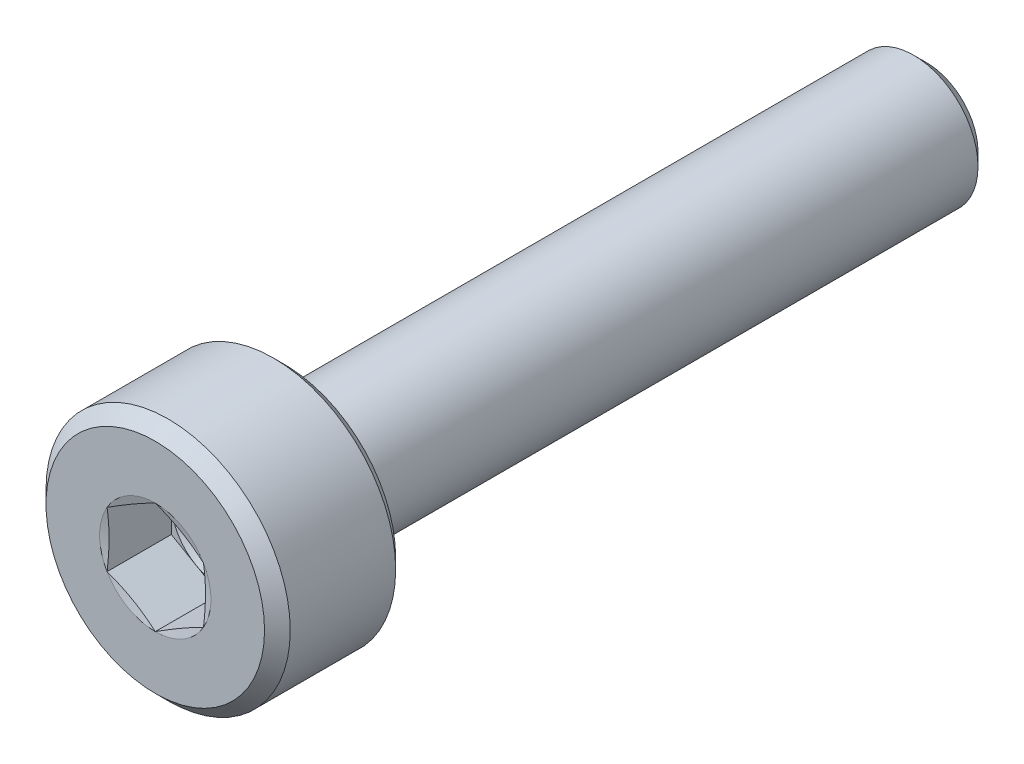
ISO-10303-21;
HEADER;
FILE_DESCRIPTION(('STEP AP214'),'2;1');
FILE_NAME('part.step','',(''),(''),'','','');
FILE_SCHEMA(('AUTOMOTIVE_DESIGN { 1 0 10303 214 1 1 1 1 }'));
ENDSEC;
DATA;
#1=APPLICATION_CONTEXT('core data for automotive mechanical design processes');
#2=APPLICATION_PROTOCOL_DEFINITION('international standard','automotive_design',2000,#1);
#3=PRODUCT_CONTEXT('',#1,'mechanical');
#4=PRODUCT('Part','Part','',(#3));
#5=PRODUCT_RELATED_PRODUCT_CATEGORY('part','',(#4));
#6=PRODUCT_DEFINITION_FORMATION('','',#4);
#7=PRODUCT_DEFINITION_CONTEXT('part definition',#1,'design');
#8=PRODUCT_DEFINITION('design','',#6,#7);
#9=PRODUCT_DEFINITION_SHAPE('','',#8);
#10=(LENGTH_UNIT() NAMED_UNIT(*) SI_UNIT(.MILLI.,.METRE.));
#11=(NAMED_UNIT(*) PLANE_ANGLE_UNIT() SI_UNIT($,.RADIAN.));
#12=(NAMED_UNIT(*) SI_UNIT($,.STERADIAN.) SOLID_ANGLE_UNIT());
#13=UNCERTAINTY_MEASURE_WITH_UNIT(LENGTH_MEASURE(1.E-05),#10,'distance_accuracy_value','');
#14=(GEOMETRIC_REPRESENTATION_CONTEXT(3) GLOBAL_UNCERTAINTY_ASSIGNED_CONTEXT((#13)) GLOBAL_UNIT_ASSIGNED_CONTEXT((#10,
#11,#12)) REPRESENTATION_CONTEXT('',''));
#15=CARTESIAN_POINT('',(0.,0.,0.));
#16=DIRECTION('',(0.,0.,1.));
#17=DIRECTION('',(1.,0.,0.));
#18=AXIS2_PLACEMENT_3D('',#15,#16,#17);
#19=CARTESIAN_POINT('',(0.,0.,0.));
#20=DIRECTION('',(0.,0.,-1.));
#21=DIRECTION('',(-1.,0.,0.));
#22=AXIS2_PLACEMENT_3D('',#19,#20,#21);
#23=PLANE('',#22);
#24=CARTESIAN_POINT('',(0.,0.,0.));
#25=DIRECTION('',(0.,0.,1.));
#26=DIRECTION('',(1.,0.,0.));
#27=AXIS2_PLACEMENT_3D('',#24,#25,#26);
#28=CIRCLE('',#27,1.7);
#29=CARTESIAN_POINT('',(1.7,0.,0.));
#30=VERTEX_POINT('',#29);
#31=EDGE_CURVE('E230',#30,#30,#28,.T.);
#32=ORIENTED_EDGE('',*,*,#31,.T.);
#33=EDGE_LOOP('',(#32));
#34=FACE_BOUND('',#33,.T.);
#35=CARTESIAN_POINT('',(0.,0.,0.));
#36=DIRECTION('',(0.,0.,1.));
#37=DIRECTION('',(1.,0.,0.));
#38=AXIS2_PLACEMENT_3D('',#35,#36,#37);
#39=CIRCLE('',#38,0.866025403784438);
#40=CARTESIAN_POINT('',(-0.75,-0.433012701892219,0.));
#41=VERTEX_POINT('',#40);
#42=CARTESIAN_POINT('',(0.,-0.866025403784438,0.));
#43=VERTEX_POINT('',#42);
#44=EDGE_CURVE('E156',#41,#43,#39,.T.);
#45=ORIENTED_EDGE('',*,*,#44,.F.);
#46=CARTESIAN_POINT('',(-0.75,0.433012701892219,0.));
#47=VERTEX_POINT('',#46);
#48=EDGE_CURVE('E155',#47,#41,#39,.T.);
#49=ORIENTED_EDGE('',*,*,#48,.F.);
#50=CARTESIAN_POINT('',(0.,0.866025403784438,0.));
#51=VERTEX_POINT('',#50);
#52=EDGE_CURVE('E122',#51,#47,#39,.T.);
#53=ORIENTED_EDGE('',*,*,#52,.F.);
#54=CARTESIAN_POINT('',(0.75,0.433012701892219,0.));
#55=VERTEX_POINT('',#54);
#56=EDGE_CURVE('E116',#55,#51,#39,.T.);
#57=ORIENTED_EDGE('',*,*,#56,.F.);
#58=CARTESIAN_POINT('',(0.749999999999999,-0.433012701892221,0.));
#59=VERTEX_POINT('',#58);
#60=EDGE_CURVE('E124',#59,#55,#39,.T.);
#61=ORIENTED_EDGE('',*,*,#60,.F.);
#62=EDGE_CURVE('E314',#43,#59,#39,.T.);
#63=ORIENTED_EDGE('',*,*,#62,.F.);
#64=EDGE_LOOP('',(#45,#49,#53,#57,#61,#63));
#65=FACE_BOUND('',#64,.T.);
#66=ADVANCED_FACE('F39',(#34,#65),#23,.F.);
#67=CARTESIAN_POINT('',(0.,0.,-0.2));
#68=DIRECTION('',(0.,0.,-1.));
#69=DIRECTION('',(-1.,0.,0.));
#70=AXIS2_PLACEMENT_3D('',#67,#68,#69);
#71=CONICAL_SURFACE('',#70,1.9,0.78539816339746);
#72=ORIENTED_EDGE('',*,*,#31,.F.);
#73=EDGE_LOOP('',(#72));
#74=FACE_BOUND('',#73,.T.);
#75=CARTESIAN_POINT('',(0.,0.,-0.2));
#76=DIRECTION('',(0.,0.,1.));
#77=DIRECTION('',(1.,0.,0.));
#78=AXIS2_PLACEMENT_3D('',#75,#76,#77);
#79=CIRCLE('',#78,1.9);
#80=CARTESIAN_POINT('',(1.9,0.,-0.2));
#81=VERTEX_POINT('',#80);
#82=EDGE_CURVE('E232',#81,#81,#79,.T.);
#83=ORIENTED_EDGE('',*,*,#82,.T.);
#84=EDGE_LOOP('',(#83));
#85=FACE_BOUND('',#84,.T.);
#86=ADVANCED_FACE('F221',(#74,#85),#71,.T.);
#87=CARTESIAN_POINT('',(0.,0.,0.));
#88=DIRECTION('',(0.,0.,1.));
#89=DIRECTION('',(1.,0.,0.));
#90=AXIS2_PLACEMENT_3D('',#87,#88,#89);
#91=CYLINDRICAL_SURFACE('',#90,1.9);
#92=ORIENTED_EDGE('',*,*,#82,.F.);
#93=EDGE_LOOP('',(#92));
#94=FACE_BOUND('',#93,.T.);
#95=CARTESIAN_POINT('',(0.,0.,-1.84));
#96=DIRECTION('',(0.,0.,1.));
#97=DIRECTION('',(1.,0.,0.));
#98=AXIS2_PLACEMENT_3D('',#95,#96,#97);
#99=CIRCLE('',#98,1.9);
#100=CARTESIAN_POINT('',(1.9,0.,-1.84));
#101=VERTEX_POINT('',#100);
#102=EDGE_CURVE('E235',#101,#101,#99,.T.);
#103=ORIENTED_EDGE('',*,*,#102,.T.);
#104=EDGE_LOOP('',(#103));
#105=FACE_BOUND('',#104,.T.);
#106=ADVANCED_FACE('F226',(#94,#105),#91,.T.);
#107=CARTESIAN_POINT('',(0.,0.,-2.));
#108=DIRECTION('',(0.,0.,1.));
#109=DIRECTION('',(1.,0.,0.));
#110=AXIS2_PLACEMENT_3D('',#107,#108,#109);
#111=CONICAL_SURFACE('',#110,1.74,0.785398163397452);
#112=ORIENTED_EDGE('',*,*,#102,.F.);
#113=EDGE_LOOP('',(#112));
#114=FACE_BOUND('',#113,.T.);
#115=CARTESIAN_POINT('',(0.,0.,-2.));
#116=DIRECTION('',(0.,0.,1.));
#117=DIRECTION('',(1.,0.,0.));
#118=AXIS2_PLACEMENT_3D('',#115,#116,#117);
#119=CIRCLE('',#118,1.74);
#120=CARTESIAN_POINT('',(1.74,0.,-2.));
#121=VERTEX_POINT('',#120);
#122=EDGE_CURVE('E240',#121,#121,#119,.T.);
#123=ORIENTED_EDGE('',*,*,#122,.T.);
#124=EDGE_LOOP('',(#123));
#125=FACE_BOUND('',#124,.T.);
#126=ADVANCED_FACE('F430',(#114,#125),#111,.T.);
#127=CARTESIAN_POINT('',(0.,1.74,-2.));
#128=DIRECTION('',(0.,0.,1.));
#129=DIRECTION('',(1.,0.,0.));
#130=AXIS2_PLACEMENT_3D('',#127,#128,#129);
#131=PLANE('',#130);
#132=ORIENTED_EDGE('',*,*,#122,.F.);
#133=EDGE_LOOP('',(#132));
#134=FACE_BOUND('',#133,.T.);
#135=CARTESIAN_POINT('',(0.,0.,-2.));
#136=DIRECTION('',(0.,0.,1.));
#137=DIRECTION('',(1.,0.,0.));
#138=AXIS2_PLACEMENT_3D('',#135,#136,#137);
#139=CIRCLE('',#138,1.3);
#140=CARTESIAN_POINT('',(1.3,0.,-2.));
#141=VERTEX_POINT('',#140);
#142=EDGE_CURVE('E243',#141,#141,#139,.T.);
#143=ORIENTED_EDGE('',*,*,#142,.T.);
#144=EDGE_LOOP('',(#143));
#145=FACE_BOUND('',#144,.T.);
#146=ADVANCED_FACE('F422',(#134,#145),#131,.F.);
#147=CARTESIAN_POINT('',(0.,0.,-2.1));
#148=DIRECTION('',(0.,0.,1.));
#149=DIRECTION('',(1.,0.,0.));
#150=AXIS2_PLACEMENT_3D('',#147,#148,#149);
#151=TOROIDAL_SURFACE('',#150,1.3,0.1);
#152=ORIENTED_EDGE('',*,*,#142,.F.);
#153=EDGE_LOOP('',(#152));
#154=FACE_BOUND('',#153,.T.);
#155=CARTESIAN_POINT('',(0.,0.,-2.05615763679786));
#156=DIRECTION('',(0.,0.,1.));
#157=DIRECTION('',(1.,0.,0.));
#158=AXIS2_PLACEMENT_3D('',#155,#156,#157);
#159=CIRCLE('',#158,1.21012315543561);
#160=CARTESIAN_POINT('',(1.21012315543561,0.,-2.05615763679786));
#161=VERTEX_POINT('',#160);
#162=EDGE_CURVE('E246',#161,#161,#159,.T.);
#163=ORIENTED_EDGE('',*,*,#162,.T.);
#164=EDGE_LOOP('',(#163));
#165=FACE_BOUND('',#164,.T.);
#166=ADVANCED_FACE('F414',(#154,#165),#151,.F.);
#167=CARTESIAN_POINT('',(0.,0.,-2.46615763679786));
#168=DIRECTION('',(0.,0.,1.));
#169=DIRECTION('',(1.,0.,0.));
#170=AXIS2_PLACEMENT_3D('',#167,#168,#169);
#171=CONICAL_SURFACE('',#170,1.01012315543561,0.453844001521509);
#172=ORIENTED_EDGE('',*,*,#162,.F.);
#173=EDGE_LOOP('',(#172));
#174=FACE_BOUND('',#173,.T.);
#175=CARTESIAN_POINT('',(0.,0.,-2.46615763679786));
#176=DIRECTION('',(0.,0.,1.));
#177=DIRECTION('',(1.,0.,0.));
#178=AXIS2_PLACEMENT_3D('',#175,#176,#177);
#179=CIRCLE('',#178,1.01012315543561);
#180=CARTESIAN_POINT('',(1.01012315543561,0.,-2.46615763679786));
#181=VERTEX_POINT('',#180);
#182=EDGE_CURVE('E249',#181,#181,#179,.T.);
#183=ORIENTED_EDGE('',*,*,#182,.T.);
#184=EDGE_LOOP('',(#183));
#185=FACE_BOUND('',#184,.T.);
#186=ADVANCED_FACE('F406',(#174,#185),#171,.T.);
#187=CARTESIAN_POINT('',(0.,0.,-2.51));
#188=DIRECTION('',(0.,0.,1.));
#189=DIRECTION('',(1.,0.,0.));
#190=AXIS2_PLACEMENT_3D('',#187,#188,#189);
#191=TOROIDAL_SURFACE('',#190,1.1,0.0999999999999999);
#192=ORIENTED_EDGE('',*,*,#182,.F.);
#193=EDGE_LOOP('',(#192));
#194=FACE_BOUND('',#193,.T.);
#195=CARTESIAN_POINT('',(0.,0.,-2.51));
#196=DIRECTION('',(0.,0.,1.));
#197=DIRECTION('',(1.,0.,0.));
#198=AXIS2_PLACEMENT_3D('',#195,#196,#197);
#199=CIRCLE('',#198,1.);
#200=CARTESIAN_POINT('',(1.,0.,-2.51));
#201=VERTEX_POINT('',#200);
#202=EDGE_CURVE('E252',#201,#201,#199,.T.);
#203=ORIENTED_EDGE('',*,*,#202,.T.);
#204=EDGE_LOOP('',(#203));
#205=FACE_BOUND('',#204,.T.);
#206=ADVANCED_FACE('F398',(#194,#205),#191,.F.);
#207=CARTESIAN_POINT('',(0.,0.,0.));
#208=DIRECTION('',(0.,0.,1.));
#209=DIRECTION('',(1.,0.,0.));
#210=AXIS2_PLACEMENT_3D('',#207,#208,#209);
#211=CYLINDRICAL_SURFACE('',#210,1.);
#212=ORIENTED_EDGE('',*,*,#202,.F.);
#213=EDGE_LOOP('',(#212));
#214=FACE_BOUND('',#213,.T.);
#215=CARTESIAN_POINT('',(0.,0.,-11.8));
#216=DIRECTION('',(0.,0.,1.));
#217=DIRECTION('',(1.,0.,0.));
#218=AXIS2_PLACEMENT_3D('',#215,#216,#217);
#219=CIRCLE('',#218,1.);
#220=CARTESIAN_POINT('',(1.,0.,-11.8));
#221=VERTEX_POINT('',#220);
#222=EDGE_CURVE('E255',#221,#221,#219,.T.);
#223=ORIENTED_EDGE('',*,*,#222,.T.);
#224=EDGE_LOOP('',(#223));
#225=FACE_BOUND('',#224,.T.);
#226=ADVANCED_FACE('F389',(#214,#225),#211,.T.);
#227=CARTESIAN_POINT('',(0.,0.,-12.));
#228=DIRECTION('',(0.,0.,1.));
#229=DIRECTION('',(1.,0.,0.));
#230=AXIS2_PLACEMENT_3D('',#227,#228,#229);
#231=CONICAL_SURFACE('',#230,0.8,0.785398163397434);
#232=ORIENTED_EDGE('',*,*,#222,.F.);
#233=EDGE_LOOP('',(#232));
#234=FACE_BOUND('',#233,.T.);
#235=CARTESIAN_POINT('',(0.,0.,-12.));
#236=DIRECTION('',(0.,0.,1.));
#237=DIRECTION('',(1.,0.,0.));
#238=AXIS2_PLACEMENT_3D('',#235,#236,#237);
#239=CIRCLE('',#238,0.8);
#240=CARTESIAN_POINT('',(0.8,0.,-12.));
#241=VERTEX_POINT('',#240);
#242=EDGE_CURVE('E258',#241,#241,#239,.T.);
#243=ORIENTED_EDGE('',*,*,#242,.T.);
#244=EDGE_LOOP('',(#243));
#245=FACE_BOUND('',#244,.T.);
#246=ADVANCED_FACE('F381',(#234,#245),#231,.T.);
#247=CARTESIAN_POINT('',(0.,0.8,-12.));
#248=DIRECTION('',(0.,0.,1.));
#249=DIRECTION('',(1.,0.,0.));
#250=AXIS2_PLACEMENT_3D('',#247,#248,#249);
#251=PLANE('',#250);
#252=ORIENTED_EDGE('',*,*,#242,.F.);
#253=EDGE_LOOP('',(#252));
#254=FACE_BOUND('',#253,.T.);
#255=ADVANCED_FACE('F375',(#254),#251,.F.);
#256=CARTESIAN_POINT('',(0.,0.,-0.0310889132455344));
#257=DIRECTION('',(0.,0.,1.));
#258=DIRECTION('',(1.,0.,0.));
#259=AXIS2_PLACEMENT_3D('',#256,#257,#258);
#260=CONICAL_SURFACE('',#259,0.75,1.30899693899575);
#261=ORIENTED_EDGE('',*,*,#52,.T.);
#262=CARTESIAN_POINT('',(-0.7502,0.432897231838381,3.09462948723988E-05));
#263=CARTESIAN_POINT('',(-0.719037840271989,0.450888713145879,-0.00479360311149042));
#264=CARTESIAN_POINT('',(-0.687819151238554,0.468912831663079,-0.00917362250903629));
#265=CARTESIAN_POINT('',(-0.625271438524168,0.505024770435926,-0.0168690566741957));
#266=CARTESIAN_POINT('',(-0.593942375178671,0.523112613591908,-0.0201840383063053));
#267=CARTESIAN_POINT('',(-0.53136401188606,0.559242248484343,-0.0255557361470388));
#268=CARTESIAN_POINT('',(-0.5001151357921,0.577283795509063,-0.0276188631563584));
#269=CARTESIAN_POINT('',(-0.437577500528089,0.613389916063223,-0.0303853199406949));
#270=CARTESIAN_POINT('',(-0.406288750264044,0.631454484450776,-0.0310889132455344));
#271=CARTESIAN_POINT('',(-0.343711249735956,0.667583621225882,-0.0310889132455345));
#272=CARTESIAN_POINT('',(-0.312422499471911,0.685648189613435,-0.0303853199406949));
#273=CARTESIAN_POINT('',(-0.2498848642079,0.721754310167594,-0.0276188631563584));
#274=CARTESIAN_POINT('',(-0.21863598811394,0.739795857192315,-0.0255557361470388));
#275=CARTESIAN_POINT('',(-0.156057624821329,0.77592549208475,-0.0201840383063053));
#276=CARTESIAN_POINT('',(-0.124728561475832,0.794013335240732,-0.0168690566741957));
#277=CARTESIAN_POINT('',(-0.0621808487614457,0.830125274013578,-0.00917362250903634));
#278=CARTESIAN_POINT('',(-0.0309621597280112,0.848149392530779,-0.00479360311149048));
#279=CARTESIAN_POINT('',(0.000200000000000003,0.866140873838276,3.09462948723373E-05));
#280=B_SPLINE_CURVE_WITH_KNOTS('',3,(#262,#263,#264,#265,#266,#267,#268,#269,#270,#271,#272,
#273,#274,#275,#276,#277,#278,#279),.UNSPECIFIED.,.F.,.F.,(4,2,2,2,2,2,2,2,4),(0.,
0.108920587259311,0.217885415043552,0.326287413293608,0.434668396966266,0.543049380638924,
0.651451378888981,0.760416206673221,0.869336793932533),.UNSPECIFIED.);
#281=EDGE_CURVE('E11',#47,#51,#280,.T.);
#282=ORIENTED_EDGE('',*,*,#281,.T.);
#283=EDGE_LOOP('',(#261,#282));
#284=FACE_BOUND('',#283,.T.);
#285=ADVANCED_FACE('F128',(#284),#260,.F.);
#286=CARTESIAN_POINT('',(-0.75,-1.14482258623613,0.13466962524668));
#287=CARTESIAN_POINT('',(-0.75,-1.07678185164575,0.11946091693451));
#288=CARTESIAN_POINT('',(-0.75,-1.00866186993933,0.104564139677019));
#289=CARTESIAN_POINT('',(-0.75,-0.872108780270127,0.0759343556155123));
#290=CARTESIAN_POINT('',(-0.75,-0.803675428468904,0.0622025196192108));
#291=CARTESIAN_POINT('',(-0.75,-0.667024328389678,0.0365778066728533));
#292=CARTESIAN_POINT('',(-0.75,-0.598809231475784,0.0246711034130511));
#293=CARTESIAN_POINT('',(-0.75,-0.461968565078349,0.00349957725576435));
#294=CARTESIAN_POINT('',(-0.75,-0.393343069174551,-0.00576570552870658));
#295=CARTESIAN_POINT('',(-0.75,-0.254874387193197,-0.0204880637590047));
#296=CARTESIAN_POINT('',(-0.75,-0.185026204144043,-0.0259009217168571));
#297=CARTESIAN_POINT('',(-0.75,-0.0451386456006473,-0.0315728233282039));
#298=CARTESIAN_POINT('',(-0.75,0.0249006157145767,-0.0318344646143007));
#299=CARTESIAN_POINT('',(-0.75,0.165046593870639,-0.0271336726580643));
#300=CARTESIAN_POINT('',(-0.75,0.235152611190908,-0.0221520199445757));
#301=CARTESIAN_POINT('',(-0.75,0.374971381665316,-0.00804964390688157));
#302=CARTESIAN_POINT('',(-0.75,0.444683810838038,0.00107409444110482));
#303=CARTESIAN_POINT('',(-0.75,0.57900664470664,0.0214252947723859));
#304=CARTESIAN_POINT('',(-0.75,0.643645711070564,0.0324706666633663));
#305=CARTESIAN_POINT('',(-0.75,0.772626203639037,0.0561976243366958));
#306=CARTESIAN_POINT('',(-0.75,0.836967591207445,0.0688794166647536));
#307=CARTESIAN_POINT('',(-0.75,0.96543538187879,0.0953387697110077));
#308=CARTESIAN_POINT('',(-0.75,1.02956173962238,0.109116548118427));
#309=CARTESIAN_POINT('',(-0.75,1.15764916486959,0.137422879220211));
#310=CARTESIAN_POINT('',(-0.75,1.22161022807931,0.151951451216337));
#311=CARTESIAN_POINT('',(-0.75,1.41205284321497,0.196019971996214));
#312=CARTESIAN_POINT('',(-0.75,1.53835925197156,0.226314183405895));
#313=CARTESIAN_POINT('',(-0.75,1.72754301618681,0.272539035787117));
#314=CARTESIAN_POINT('',(-0.75,1.79052001268668,0.28806821024875));
#315=CARTESIAN_POINT('',(-0.75,1.91641912521064,0.319338785610066));
#316=CARTESIAN_POINT('',(-0.75,1.97934124297332,0.335080179505711));
#317=CARTESIAN_POINT('',(-0.75,2.04224365999308,0.350900921516616));
#318=B_SPLINE_CURVE_WITH_KNOTS('',3,(#286,#287,#288,#289,#290,#291,#292,#293,#294,#295,#296,
#297,#298,#299,#300,#301,#302,#303,#304,#305,#306,#307,#308,#309,#310,#311,#312,#313,#314,#315,
#316,#317),.UNSPECIFIED.,.F.,.F.,(4,2,2,2,2,2,2,2,2,2,2,2,2,2,2,4),(0.,0.209172832960231,
0.418553461255022,0.626259888239563,0.833930130186138,1.04394713172849,1.25385822411851,
1.46454144122955,1.67537826112991,1.87207734374703,2.06880127765738,2.26556438371338,
2.46233255076827,2.85198678875997,3.04657695287832,3.24116071043612),.UNSPECIFIED.);
#319=EDGE_CURVE('E121',#41,#47,#318,.T.);
#320=ORIENTED_EDGE('',*,*,#319,.T.);
#321=ORIENTED_EDGE('',*,*,#48,.T.);
#322=EDGE_LOOP('',(#320,#321));
#323=FACE_BOUND('',#322,.T.);
#324=ADVANCED_FACE('F362',(#323),#260,.F.);
#325=CARTESIAN_POINT('',(0.000199999999999821,-0.866140873838277,3.0946294872561E-05));
#326=CARTESIAN_POINT('',(-0.0309621597280112,-0.84814939253078,-0.00479360311149026));
#327=CARTESIAN_POINT('',(-0.0621808487614458,-0.830125274013579,-0.00917362250903614));
#328=CARTESIAN_POINT('',(-0.124728561475833,-0.794013335240732,-0.0168690566741955));
#329=CARTESIAN_POINT('',(-0.15605762482133,-0.775925492084751,-0.0201840383063051));
#330=CARTESIAN_POINT('',(-0.218635988113941,-0.739795857192316,-0.0255557361470386));
#331=CARTESIAN_POINT('',(-0.2498848642079,-0.721754310167595,-0.0276188631563583));
#332=CARTESIAN_POINT('',(-0.312422499471911,-0.685648189613436,-0.0303853199406947));
#333=CARTESIAN_POINT('',(-0.343711249735956,-0.667583621225883,-0.0310889132455343));
#334=CARTESIAN_POINT('',(-0.406288750264045,-0.631454484450776,-0.0310889132455343));
#335=CARTESIAN_POINT('',(-0.437577500528089,-0.613389916063223,-0.0303853199406947));
#336=CARTESIAN_POINT('',(-0.5001151357921,-0.577283795509064,-0.0276188631563583));
#337=CARTESIAN_POINT('',(-0.53136401188606,-0.559242248484343,-0.0255557361470387));
#338=CARTESIAN_POINT('',(-0.593942375178671,-0.523112613591908,-0.0201840383063052));
#339=CARTESIAN_POINT('',(-0.625271438524168,-0.505024770435926,-0.0168690566741956));
#340=CARTESIAN_POINT('',(-0.687819151238555,-0.46891283166308,-0.0091736225090362));
#341=CARTESIAN_POINT('',(-0.719037840271989,-0.450888713145879,-0.00479360311149033));
#342=CARTESIAN_POINT('',(-0.7502,-0.432897231838382,3.09462948724902E-05));
#343=B_SPLINE_CURVE_WITH_KNOTS('',3,(#325,#326,#327,#328,#329,#330,#331,#332,#333,#334,#335,
#336,#337,#338,#339,#340,#341,#342),.UNSPECIFIED.,.F.,.F.,(4,2,2,2,2,2,2,2,4),(0.,
0.108920587259312,0.217885415043552,0.326287413293608,0.434668396966266,0.543049380638925,
0.651451378888981,0.760416206673221,0.869336793932533),.UNSPECIFIED.);
#344=EDGE_CURVE('E164',#43,#41,#343,.T.);
#345=ORIENTED_EDGE('',*,*,#344,.T.);
#346=ORIENTED_EDGE('',*,*,#44,.T.);
#347=EDGE_LOOP('',(#345,#346));
#348=FACE_BOUND('',#347,.T.);
#349=ADVANCED_FACE('F356',(#348),#260,.F.);
#350=CARTESIAN_POINT('',(0.7502,-0.432897231838382,3.0946294872516E-05));
#351=CARTESIAN_POINT('',(0.719037840271989,-0.45088871314588,-0.00479360311149026));
#352=CARTESIAN_POINT('',(0.687819151238554,-0.46891283166308,-0.00917362250903614));
#353=CARTESIAN_POINT('',(0.625271438524167,-0.505024770435927,-0.0168690566741955));
#354=CARTESIAN_POINT('',(0.59394237517867,-0.523112613591908,-0.0201840383063052));
#355=CARTESIAN_POINT('',(0.531364011886059,-0.559242248484343,-0.0255557361470386));
#356=CARTESIAN_POINT('',(0.5001151357921,-0.577283795509064,-0.0276188631563582));
#357=CARTESIAN_POINT('',(0.437577500528089,-0.613389916063224,-0.0303853199406947));
#358=CARTESIAN_POINT('',(0.406288750264044,-0.631454484450777,-0.0310889132455343));
#359=CARTESIAN_POINT('',(0.343711249735955,-0.667583621225883,-0.0310889132455343));
#360=CARTESIAN_POINT('',(0.312422499471911,-0.685648189613436,-0.0303853199406947));
#361=CARTESIAN_POINT('',(0.2498848642079,-0.721754310167595,-0.0276188631563582));
#362=CARTESIAN_POINT('',(0.21863598811394,-0.739795857192316,-0.0255557361470386));
#363=CARTESIAN_POINT('',(0.156057624821329,-0.775925492084751,-0.0201840383063051));
#364=CARTESIAN_POINT('',(0.124728561475832,-0.794013335240733,-0.0168690566741955));
#365=CARTESIAN_POINT('',(0.0621808487614455,-0.830125274013579,-0.00917362250903611));
#366=CARTESIAN_POINT('',(0.0309621597280109,-0.84814939253078,-0.00479360311149025));
#367=CARTESIAN_POINT('',(-0.000200000000000211,-0.866140873838277,3.09462948725669E-05));
#368=B_SPLINE_CURVE_WITH_KNOTS('',3,(#350,#351,#352,#353,#354,#355,#356,#357,#358,#359,#360,
#361,#362,#363,#364,#365,#366,#367),.UNSPECIFIED.,.F.,.F.,(4,2,2,2,2,2,2,2,4),(0.,
0.108920587259312,0.217885415043551,0.326287413293608,0.434668396966266,0.543049380638924,
0.651451378888981,0.760416206673221,0.869336793932533),.UNSPECIFIED.);
#369=EDGE_CURVE('E184',#59,#43,#368,.T.);
#370=ORIENTED_EDGE('',*,*,#369,.T.);
#371=ORIENTED_EDGE('',*,*,#62,.T.);
#372=EDGE_LOOP('',(#370,#371));
#373=FACE_BOUND('',#372,.T.);
#374=ADVANCED_FACE('F350',(#373),#260,.F.);
#375=CARTESIAN_POINT('',(0.75,-1.14482258623613,0.13466962524668));
#376=CARTESIAN_POINT('',(0.75,-1.07678185164575,0.11946091693451));
#377=CARTESIAN_POINT('',(0.75,-1.00866186993933,0.104564139677019));
#378=CARTESIAN_POINT('',(0.75,-0.872108780270127,0.0759343556155123));
#379=CARTESIAN_POINT('',(0.75,-0.803675428468904,0.0622025196192108));
#380=CARTESIAN_POINT('',(0.75,-0.667024328389678,0.0365778066728533));
#381=CARTESIAN_POINT('',(0.75,-0.598809231475784,0.0246711034130512));
#382=CARTESIAN_POINT('',(0.75,-0.461968565078349,0.00349957725576444));
#383=CARTESIAN_POINT('',(0.75,-0.393343069174551,-0.00576570552870653));
#384=CARTESIAN_POINT('',(0.75,-0.254874387193197,-0.0204880637590047));
#385=CARTESIAN_POINT('',(0.75,-0.185026204144043,-0.025900921716857));
#386=CARTESIAN_POINT('',(0.75,-0.045138645600648,-0.0315728233282039));
#387=CARTESIAN_POINT('',(0.75,0.0249006157145759,-0.0318344646143007));
#388=CARTESIAN_POINT('',(0.75,0.165046593870639,-0.0271336726580643));
#389=CARTESIAN_POINT('',(0.75,0.235152611190908,-0.0221520199445758));
#390=CARTESIAN_POINT('',(0.75,0.374971381665316,-0.00804964390688162));
#391=CARTESIAN_POINT('',(0.75,0.444683810838037,0.00107409444110477));
#392=CARTESIAN_POINT('',(0.75,0.57900664470664,0.0214252947723859));
#393=CARTESIAN_POINT('',(0.75,0.643645711070564,0.0324706666633663));
#394=CARTESIAN_POINT('',(0.75,0.772626203639037,0.0561976243366958));
#395=CARTESIAN_POINT('',(0.75,0.836967591207445,0.0688794166647536));
#396=CARTESIAN_POINT('',(0.75,0.965435381878789,0.0953387697110076));
#397=CARTESIAN_POINT('',(0.75,1.02956173962238,0.109116548118427));
#398=CARTESIAN_POINT('',(0.75,1.15764916486959,0.137422879220212));
#399=CARTESIAN_POINT('',(0.75,1.22161022807931,0.151951451216337));
#400=CARTESIAN_POINT('',(0.75,1.41205284321498,0.196019971996214));
#401=CARTESIAN_POINT('',(0.75,1.53835925197156,0.226314183405895));
#402=CARTESIAN_POINT('',(0.75,1.72754301618681,0.272539035787117));
#403=CARTESIAN_POINT('',(0.75,1.79052001268668,0.28806821024875));
#404=CARTESIAN_POINT('',(0.75,1.91641912521064,0.319338785610067));
#405=CARTESIAN_POINT('',(0.75,1.97934124297332,0.335080179505711));
#406=CARTESIAN_POINT('',(0.75,2.04224365999308,0.350900921516616));
#407=B_SPLINE_CURVE_WITH_KNOTS('',3,(#375,#376,#377,#378,#379,#380,#381,#382,#383,#384,#385,
#386,#387,#388,#389,#390,#391,#392,#393,#394,#395,#396,#397,#398,#399,#400,#401,#402,#403,#404,
#405,#406),.UNSPECIFIED.,.F.,.F.,(4,2,2,2,2,2,2,2,2,2,2,2,2,2,2,4),(0.,0.209172832960231,
0.418553461255022,0.626259888239563,0.833930130186138,1.04394713172849,1.25385822411851,
1.46454144122955,1.67537826112991,1.87207734374703,2.06880127765738,2.26556438371338,
2.46233255076827,2.85198678875997,3.04657695287832,3.24116071043612),.UNSPECIFIED.);
#408=EDGE_CURVE('E64',#55,#59,#407,.F.);
#409=ORIENTED_EDGE('',*,*,#408,.T.);
#410=ORIENTED_EDGE('',*,*,#60,.T.);
#411=EDGE_LOOP('',(#409,#410));
#412=FACE_BOUND('',#411,.T.);
#413=ADVANCED_FACE('F177',(#412),#260,.F.);
#414=CARTESIAN_POINT('',(-0.000199999999999916,0.866140873838276,3.094629487239E-05));
#415=CARTESIAN_POINT('',(0.0309621597280112,0.848149392530779,-0.00479360311149047));
#416=CARTESIAN_POINT('',(0.0621808487614458,0.830125274013578,-0.00917362250903634));
#417=CARTESIAN_POINT('',(0.124728561475833,0.794013335240732,-0.0168690566741957));
#418=CARTESIAN_POINT('',(0.15605762482133,0.77592549208475,-0.0201840383063053));
#419=CARTESIAN_POINT('',(0.218635988113941,0.739795857192315,-0.0255557361470388));
#420=CARTESIAN_POINT('',(0.2498848642079,0.721754310167594,-0.0276188631563584));
#421=CARTESIAN_POINT('',(0.312422499471911,0.685648189613435,-0.0303853199406949));
#422=CARTESIAN_POINT('',(0.343711249735956,0.667583621225882,-0.0310889132455344));
#423=CARTESIAN_POINT('',(0.406288750264045,0.631454484450776,-0.0310889132455344));
#424=CARTESIAN_POINT('',(0.437577500528089,0.613389916063223,-0.0303853199406949));
#425=CARTESIAN_POINT('',(0.5001151357921,0.577283795509063,-0.0276188631563584));
#426=CARTESIAN_POINT('',(0.53136401188606,0.559242248484342,-0.0255557361470388));
#427=CARTESIAN_POINT('',(0.593942375178671,0.523112613591907,-0.0201840383063053));
#428=CARTESIAN_POINT('',(0.625271438524168,0.505024770435926,-0.0168690566741956));
#429=CARTESIAN_POINT('',(0.687819151238555,0.468912831663079,-0.00917362250903628));
#430=CARTESIAN_POINT('',(0.719037840271989,0.450888713145878,-0.00479360311149041));
#431=CARTESIAN_POINT('',(0.7502,0.432897231838381,3.09462948724049E-05));
#432=B_SPLINE_CURVE_WITH_KNOTS('',3,(#414,#415,#416,#417,#418,#419,#420,#421,#422,#423,#424,
#425,#426,#427,#428,#429,#430,#431),.UNSPECIFIED.,.F.,.F.,(4,2,2,2,2,2,2,2,4),(0.,
0.108920587259312,0.217885415043552,0.326287413293608,0.434668396966266,0.543049380638924,
0.651451378888981,0.760416206673221,0.869336793932533),.UNSPECIFIED.);
#433=EDGE_CURVE('E58',#51,#55,#432,.T.);
#434=ORIENTED_EDGE('',*,*,#433,.T.);
#435=ORIENTED_EDGE('',*,*,#56,.T.);
#436=EDGE_LOOP('',(#434,#435));
#437=FACE_BOUND('',#436,.T.);
#438=ADVANCED_FACE('F117',(#437),#260,.F.);
#439=CARTESIAN_POINT('',(0.,0.,-1.43301270189222));
#440=DIRECTION('',(0.,0.,1.));
#441=DIRECTION('',(1.,0.,0.));
#442=AXIS2_PLACEMENT_3D('',#439,#440,#441);
#443=CONICAL_SURFACE('',#442,0.,1.0471975511966);
#444=CARTESIAN_POINT('',(0.,0.,-1.));
#445=DIRECTION('',(0.,0.,1.));
#446=DIRECTION('',(1.,0.,0.));
#447=AXIS2_PLACEMENT_3D('',#444,#445,#446);
#448=CIRCLE('',#447,0.75);
#449=CARTESIAN_POINT('',(0.75,0.,-1.));
#450=VERTEX_POINT('',#449);
#451=CARTESIAN_POINT('',(0.375,0.649519052838329,-1.));
#452=VERTEX_POINT('',#451);
#453=EDGE_CURVE('E144',#450,#452,#448,.T.);
#454=ORIENTED_EDGE('',*,*,#453,.T.);
#455=CARTESIAN_POINT('',(-0.375,0.649519052838329,-1.));
#456=VERTEX_POINT('',#455);
#457=EDGE_CURVE('E52',#452,#456,#448,.T.);
#458=ORIENTED_EDGE('',*,*,#457,.T.);
#459=CARTESIAN_POINT('',(-0.75,0.,-1.));
#460=VERTEX_POINT('',#459);
#461=EDGE_CURVE('E295',#456,#460,#448,.T.);
#462=ORIENTED_EDGE('',*,*,#461,.T.);
#463=CARTESIAN_POINT('',(-0.375,-0.649519052838329,-1.));
#464=VERTEX_POINT('',#463);
#465=EDGE_CURVE('E297',#460,#464,#448,.T.);
#466=ORIENTED_EDGE('',*,*,#465,.T.);
#467=CARTESIAN_POINT('',(0.375,-0.649519052838329,-1.));
#468=VERTEX_POINT('',#467);
#469=EDGE_CURVE('E233',#464,#468,#448,.T.);
#470=ORIENTED_EDGE('',*,*,#469,.T.);
#471=EDGE_CURVE('E231',#468,#450,#448,.T.);
#472=ORIENTED_EDGE('',*,*,#471,.T.);
#473=EDGE_LOOP('',(#454,#458,#462,#466,#470,#472));
#474=FACE_BOUND('',#473,.T.);
#475=CARTESIAN_POINT('',(0.,0.,-1.43301270189222));
#476=VERTEX_POINT('',#475);
#477=VERTEX_LOOP('',#476);
#478=FACE_BOUND('',#477,.T.);
#479=ADVANCED_FACE('F176',(#474,#478),#443,.F.);
#480=CARTESIAN_POINT('',(0.,0.,-1.));
#481=DIRECTION('',(0.,0.,1.));
#482=DIRECTION('',(1.,0.,0.));
#483=AXIS2_PLACEMENT_3D('',#480,#481,#482);
#484=PLANE('',#483);
#485=ORIENTED_EDGE('',*,*,#453,.F.);
#486=DIRECTION('',(0.,1.,0.));
#487=VECTOR('',#486,1.);
#488=CARTESIAN_POINT('',(0.75,-0.43301270189222,-1.));
#489=LINE('',#488,#487);
#490=CARTESIAN_POINT('',(0.75,0.433012701892219,-1.));
#491=VERTEX_POINT('',#490);
#492=EDGE_CURVE('E274',#450,#491,#489,.T.);
#493=ORIENTED_EDGE('',*,*,#492,.T.);
#494=DIRECTION('',(-0.866025403784439,0.5,0.));
#495=VECTOR('',#494,1.);
#496=CARTESIAN_POINT('',(0.75,0.433012701892219,-1.));
#497=LINE('',#496,#495);
#498=EDGE_CURVE('E289',#491,#452,#497,.T.);
#499=ORIENTED_EDGE('',*,*,#498,.T.);
#500=EDGE_LOOP('',(#485,#493,#499));
#501=FACE_BOUND('',#500,.T.);
#502=ADVANCED_FACE('F319',(#501),#484,.T.);
#503=ORIENTED_EDGE('',*,*,#471,.F.);
#504=DIRECTION('',(0.866025403784439,0.5,0.));
#505=VECTOR('',#504,1.);
#506=CARTESIAN_POINT('',(0.,-0.866025403784439,-1.));
#507=LINE('',#506,#505);
#508=CARTESIAN_POINT('',(0.75,-0.43301270189222,-1.));
#509=VERTEX_POINT('',#508);
#510=EDGE_CURVE('E278',#468,#509,#507,.T.);
#511=ORIENTED_EDGE('',*,*,#510,.T.);
#512=EDGE_CURVE('E151',#509,#450,#489,.T.);
#513=ORIENTED_EDGE('',*,*,#512,.T.);
#514=EDGE_LOOP('',(#503,#511,#513));
#515=FACE_BOUND('',#514,.T.);
#516=ADVANCED_FACE('F207',(#515),#484,.T.);
#517=ORIENTED_EDGE('',*,*,#469,.F.);
#518=DIRECTION('',(0.866025403784438,-0.5,0.));
#519=VECTOR('',#518,1.);
#520=CARTESIAN_POINT('',(-0.75,-0.43301270189222,-1.));
#521=LINE('',#520,#519);
#522=CARTESIAN_POINT('',(0.,-0.866025403784439,-1.));
#523=VERTEX_POINT('',#522);
#524=EDGE_CURVE('E282',#464,#523,#521,.T.);
#525=ORIENTED_EDGE('',*,*,#524,.T.);
#526=EDGE_CURVE('E275',#523,#468,#507,.T.);
#527=ORIENTED_EDGE('',*,*,#526,.T.);
#528=EDGE_LOOP('',(#517,#525,#527));
#529=FACE_BOUND('',#528,.T.);
#530=ADVANCED_FACE('F310',(#529),#484,.T.);
#531=ORIENTED_EDGE('',*,*,#465,.F.);
#532=DIRECTION('',(0.,-1.,0.));
#533=VECTOR('',#532,1.);
#534=CARTESIAN_POINT('',(-0.75,0.433012701892219,-1.));
#535=LINE('',#534,#533);
#536=CARTESIAN_POINT('',(-0.75,-0.43301270189222,-1.));
#537=VERTEX_POINT('',#536);
#538=EDGE_CURVE('E286',#460,#537,#535,.T.);
#539=ORIENTED_EDGE('',*,*,#538,.T.);
#540=EDGE_CURVE('E279',#537,#464,#521,.T.);
#541=ORIENTED_EDGE('',*,*,#540,.T.);
#542=EDGE_LOOP('',(#531,#539,#541));
#543=FACE_BOUND('',#542,.T.);
#544=ADVANCED_FACE('F324',(#543),#484,.T.);
#545=ORIENTED_EDGE('',*,*,#457,.F.);
#546=CARTESIAN_POINT('',(0.,0.866025403784438,-1.));
#547=VERTEX_POINT('',#546);
#548=EDGE_CURVE('E291',#452,#547,#497,.T.);
#549=ORIENTED_EDGE('',*,*,#548,.T.);
#550=DIRECTION('',(-0.866025403784439,-0.5,0.));
#551=VECTOR('',#550,1.);
#552=CARTESIAN_POINT('',(0.,0.866025403784438,-1.));
#553=LINE('',#552,#551);
#554=EDGE_CURVE('E149',#547,#456,#553,.T.);
#555=ORIENTED_EDGE('',*,*,#554,.T.);
#556=EDGE_LOOP('',(#545,#549,#555));
#557=FACE_BOUND('',#556,.T.);
#558=ADVANCED_FACE('F321',(#557),#484,.T.);
#559=ORIENTED_EDGE('',*,*,#461,.F.);
#560=CARTESIAN_POINT('',(-0.75,0.433012701892219,-1.));
#561=VERTEX_POINT('',#560);
#562=EDGE_CURVE('E288',#456,#561,#553,.T.);
#563=ORIENTED_EDGE('',*,*,#562,.T.);
#564=EDGE_CURVE('E283',#561,#460,#535,.T.);
#565=ORIENTED_EDGE('',*,*,#564,.T.);
#566=EDGE_LOOP('',(#559,#563,#565));
#567=FACE_BOUND('',#566,.T.);
#568=ADVANCED_FACE('F323',(#567),#484,.T.);
#569=CARTESIAN_POINT('',(0.,0.866025403784438,-1.));
#570=DIRECTION('',(-0.5,0.866025403784439,0.));
#571=DIRECTION('',(-0.866025403784439,-0.5,0.));
#572=AXIS2_PLACEMENT_3D('',#569,#570,#571);
#573=PLANE('',#572);
#574=ORIENTED_EDGE('',*,*,#281,.F.);
#575=DIRECTION('',(0.,0.,1.));
#576=VECTOR('',#575,1.);
#577=CARTESIAN_POINT('',(-0.75,0.433012701892219,-1.));
#578=LINE('',#577,#576);
#579=EDGE_CURVE('E150',#561,#47,#578,.T.);
#580=ORIENTED_EDGE('',*,*,#579,.F.);
#581=ORIENTED_EDGE('',*,*,#562,.F.);
#582=ORIENTED_EDGE('',*,*,#554,.F.);
#583=DIRECTION('',(0.,0.,1.));
#584=VECTOR('',#583,1.);
#585=CARTESIAN_POINT('',(0.,0.866025403784438,-1.));
#586=LINE('',#585,#584);
#587=EDGE_CURVE('E139',#547,#51,#586,.T.);
#588=ORIENTED_EDGE('',*,*,#587,.T.);
#589=EDGE_LOOP('',(#574,#580,#581,#582,#588));
#590=FACE_BOUND('',#589,.T.);
#591=ADVANCED_FACE('F146',(#590),#573,.F.);
#592=CARTESIAN_POINT('',(-0.75,0.433012701892219,-1.));
#593=DIRECTION('',(-1.,0.,0.));
#594=DIRECTION('',(0.,0.,1.));
#595=AXIS2_PLACEMENT_3D('',#592,#593,#594);
#596=PLANE('',#595);
#597=ORIENTED_EDGE('',*,*,#319,.F.);
#598=DIRECTION('',(0.,0.,1.));
#599=VECTOR('',#598,1.);
#600=CARTESIAN_POINT('',(-0.75,-0.43301270189222,-1.));
#601=LINE('',#600,#599);
#602=EDGE_CURVE('E262',#537,#41,#601,.T.);
#603=ORIENTED_EDGE('',*,*,#602,.F.);
#604=ORIENTED_EDGE('',*,*,#538,.F.);
#605=ORIENTED_EDGE('',*,*,#564,.F.);
#606=ORIENTED_EDGE('',*,*,#579,.T.);
#607=EDGE_LOOP('',(#597,#603,#604,#605,#606));
#608=FACE_BOUND('',#607,.T.);
#609=ADVANCED_FACE('F171',(#608),#596,.F.);
#610=CARTESIAN_POINT('',(-0.75,-0.43301270189222,-1.));
#611=DIRECTION('',(-0.5,-0.866025403784439,0.));
#612=DIRECTION('',(0.866025403784438,-0.5,0.));
#613=AXIS2_PLACEMENT_3D('',#610,#611,#612);
#614=PLANE('',#613);
#615=ORIENTED_EDGE('',*,*,#344,.F.);
#616=DIRECTION('',(0.,0.,1.));
#617=VECTOR('',#616,1.);
#618=CARTESIAN_POINT('',(0.,-0.866025403784439,-1.));
#619=LINE('',#618,#617);
#620=EDGE_CURVE('E265',#523,#43,#619,.T.);
#621=ORIENTED_EDGE('',*,*,#620,.F.);
#622=ORIENTED_EDGE('',*,*,#524,.F.);
#623=ORIENTED_EDGE('',*,*,#540,.F.);
#624=ORIENTED_EDGE('',*,*,#602,.T.);
#625=EDGE_LOOP('',(#615,#621,#622,#623,#624));
#626=FACE_BOUND('',#625,.T.);
#627=ADVANCED_FACE('F210',(#626),#614,.F.);
#628=CARTESIAN_POINT('',(0.,-0.866025403784439,-1.));
#629=DIRECTION('',(0.5,-0.866025403784439,0.));
#630=DIRECTION('',(0.866025403784439,0.5,0.));
#631=AXIS2_PLACEMENT_3D('',#628,#629,#630);
#632=PLANE('',#631);
#633=ORIENTED_EDGE('',*,*,#369,.F.);
#634=DIRECTION('',(0.,0.,1.));
#635=VECTOR('',#634,1.);
#636=CARTESIAN_POINT('',(0.75,-0.43301270189222,-1.));
#637=LINE('',#636,#635);
#638=EDGE_CURVE('E268',#509,#59,#637,.T.);
#639=ORIENTED_EDGE('',*,*,#638,.F.);
#640=ORIENTED_EDGE('',*,*,#510,.F.);
#641=ORIENTED_EDGE('',*,*,#526,.F.);
#642=ORIENTED_EDGE('',*,*,#620,.T.);
#643=EDGE_LOOP('',(#633,#639,#640,#641,#642));
#644=FACE_BOUND('',#643,.T.);
#645=ADVANCED_FACE('F205',(#644),#632,.F.);
#646=CARTESIAN_POINT('',(0.75,-0.43301270189222,-1.));
#647=DIRECTION('',(1.,0.,0.));
#648=DIRECTION('',(0.,1.,0.));
#649=AXIS2_PLACEMENT_3D('',#646,#647,#648);
#650=PLANE('',#649);
#651=ORIENTED_EDGE('',*,*,#408,.F.);
#652=DIRECTION('',(0.,0.,1.));
#653=VECTOR('',#652,1.);
#654=CARTESIAN_POINT('',(0.75,0.433012701892219,-1.));
#655=LINE('',#654,#653);
#656=EDGE_CURVE('E143',#491,#55,#655,.T.);
#657=ORIENTED_EDGE('',*,*,#656,.F.);
#658=ORIENTED_EDGE('',*,*,#492,.F.);
#659=ORIENTED_EDGE('',*,*,#512,.F.);
#660=ORIENTED_EDGE('',*,*,#638,.T.);
#661=EDGE_LOOP('',(#651,#657,#658,#659,#660));
#662=FACE_BOUND('',#661,.T.);
#663=ADVANCED_FACE('F202',(#662),#650,.F.);
#664=CARTESIAN_POINT('',(0.75,0.433012701892219,-1.));
#665=DIRECTION('',(0.5,0.866025403784439,0.));
#666=DIRECTION('',(-0.866025403784439,0.5,0.));
#667=AXIS2_PLACEMENT_3D('',#664,#665,#666);
#668=PLANE('',#667);
#669=ORIENTED_EDGE('',*,*,#433,.F.);
#670=ORIENTED_EDGE('',*,*,#587,.F.);
#671=ORIENTED_EDGE('',*,*,#548,.F.);
#672=ORIENTED_EDGE('',*,*,#498,.F.);
#673=ORIENTED_EDGE('',*,*,#656,.T.);
#674=EDGE_LOOP('',(#669,#670,#671,#672,#673));
#675=FACE_BOUND('',#674,.T.);
#676=ADVANCED_FACE('F137',(#675),#668,.F.);
#677=CLOSED_SHELL('',(#66,#86,#106,#126,#146,#166,#186,#206,#226,#246,#255,#285,#324,#349,#374,
#413,#438,#479,#502,#516,#530,#544,#558,#568,#591,#609,#627,#645,#663,#676));
#678=MANIFOLD_SOLID_BREP('B2',#677);
#679=ADVANCED_BREP_SHAPE_REPRESENTATION('',(#18,#678),#14);
#680=SHAPE_DEFINITION_REPRESENTATION(#9,#679);
ENDSEC;
END-ISO-10303-21;
